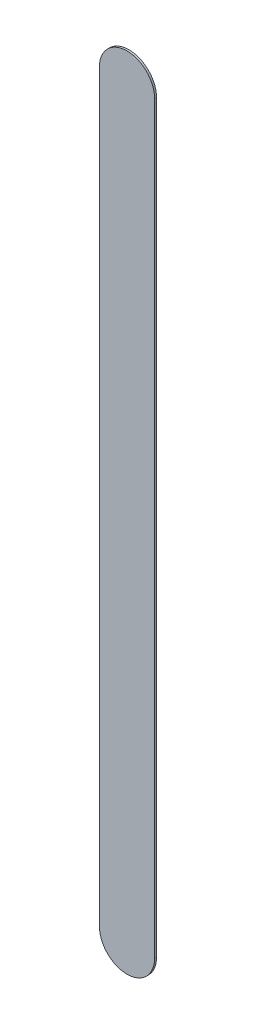
ISO-10303-21;
HEADER;
FILE_DESCRIPTION(('STEP AP214'),'2;1');
FILE_NAME('part.step','',(''),(''),'','','');
FILE_SCHEMA(('AUTOMOTIVE_DESIGN { 1 0 10303 214 1 1 1 1 }'));
ENDSEC;
DATA;
#1=APPLICATION_CONTEXT('core data for automotive mechanical design processes');
#2=APPLICATION_PROTOCOL_DEFINITION('international standard','automotive_design',2000,#1);
#3=PRODUCT_CONTEXT('',#1,'mechanical');
#4=PRODUCT('Part','Part','',(#3));
#5=PRODUCT_RELATED_PRODUCT_CATEGORY('part','',(#4));
#6=PRODUCT_DEFINITION_FORMATION('','',#4);
#7=PRODUCT_DEFINITION_CONTEXT('part definition',#1,'design');
#8=PRODUCT_DEFINITION('design','',#6,#7);
#9=PRODUCT_DEFINITION_SHAPE('','',#8);
#10=(LENGTH_UNIT() NAMED_UNIT(*) SI_UNIT(.MILLI.,.METRE.));
#11=(NAMED_UNIT(*) PLANE_ANGLE_UNIT() SI_UNIT($,.RADIAN.));
#12=(NAMED_UNIT(*) SI_UNIT($,.STERADIAN.) SOLID_ANGLE_UNIT());
#13=UNCERTAINTY_MEASURE_WITH_UNIT(LENGTH_MEASURE(1.E-05),#10,'distance_accuracy_value','');
#14=(GEOMETRIC_REPRESENTATION_CONTEXT(3) GLOBAL_UNCERTAINTY_ASSIGNED_CONTEXT((#13)) GLOBAL_UNIT_ASSIGNED_CONTEXT((#10,
#11,#12)) REPRESENTATION_CONTEXT('',''));
#15=CARTESIAN_POINT('',(0.,0.,0.));
#16=DIRECTION('',(0.,0.,1.));
#17=DIRECTION('',(1.,0.,0.));
#18=AXIS2_PLACEMENT_3D('',#15,#16,#17);
#19=CARTESIAN_POINT('',(99.89999832,99.50000166,0.));
#20=DIRECTION('',(-1.,0.,0.));
#21=DIRECTION('',(0.,1.,0.));
#22=AXIS2_PLACEMENT_3D('',#19,#20,#21);
#23=PLANE('',#22);
#24=DIRECTION('',(0.,1.,0.));
#25=VECTOR('',#24,1.);
#26=CARTESIAN_POINT('',(99.89999832,99.50000166,0.03556));
#27=LINE('',#26,#25);
#28=CARTESIAN_POINT('',(99.89999832,99.50000166,0.03556));
#29=VERTEX_POINT('',#28);
#30=CARTESIAN_POINT('',(99.89999832,113.00000006,0.03556));
#31=VERTEX_POINT('',#30);
#32=EDGE_CURVE('E11',#29,#31,#27,.T.);
#33=ORIENTED_EDGE('',*,*,#32,.F.);
#34=DIRECTION('',(0.,0.,1.));
#35=VECTOR('',#34,1.);
#36=CARTESIAN_POINT('',(99.89999832,99.50000166,0.));
#37=LINE('',#36,#35);
#38=CARTESIAN_POINT('',(99.89999832,99.50000166,0.));
#39=VERTEX_POINT('',#38);
#40=EDGE_CURVE('E24',#39,#29,#37,.T.);
#41=ORIENTED_EDGE('',*,*,#40,.F.);
#42=DIRECTION('',(0.,1.,0.));
#43=VECTOR('',#42,1.);
#44=CARTESIAN_POINT('',(99.89999832,99.50000166,0.));
#45=LINE('',#44,#43);
#46=CARTESIAN_POINT('',(99.89999832,113.00000006,0.));
#47=VERTEX_POINT('',#46);
#48=EDGE_CURVE('E75',#39,#47,#45,.T.);
#49=ORIENTED_EDGE('',*,*,#48,.T.);
#50=DIRECTION('',(0.,0.,1.));
#51=VECTOR('',#50,1.);
#52=CARTESIAN_POINT('',(99.89999832,113.00000006,0.));
#53=LINE('',#52,#51);
#54=EDGE_CURVE('E37',#47,#31,#53,.T.);
#55=ORIENTED_EDGE('',*,*,#54,.T.);
#56=EDGE_LOOP('',(#33,#41,#49,#55));
#57=FACE_BOUND('',#56,.T.);
#58=ADVANCED_FACE('F17',(#57),#23,.F.);
#59=CARTESIAN_POINT('',(99.39999932,113.00000006,0.));
#60=DIRECTION('',(0.,0.,-1.));
#61=DIRECTION('',(1.,0.,0.));
#62=AXIS2_PLACEMENT_3D('',#59,#60,#61);
#63=CYLINDRICAL_SURFACE('',#62,0.499999000000012);
#64=CARTESIAN_POINT('',(99.39999932,113.00000006,0.03556));
#65=DIRECTION('',(0.,0.,1.));
#66=DIRECTION('',(1.,0.,0.));
#67=AXIS2_PLACEMENT_3D('',#64,#65,#66);
#68=CIRCLE('',#67,0.499999000000012);
#69=CARTESIAN_POINT('',(98.90000032,113.00000006,0.03556));
#70=VERTEX_POINT('',#69);
#71=EDGE_CURVE('E83',#31,#70,#68,.T.);
#72=ORIENTED_EDGE('',*,*,#71,.F.);
#73=ORIENTED_EDGE('',*,*,#54,.F.);
#74=CARTESIAN_POINT('',(99.39999932,113.00000006,0.));
#75=DIRECTION('',(0.,0.,1.));
#76=DIRECTION('',(1.,0.,0.));
#77=AXIS2_PLACEMENT_3D('',#74,#75,#76);
#78=CIRCLE('',#77,0.499999000000012);
#79=CARTESIAN_POINT('',(98.90000032,113.00000006,0.));
#80=VERTEX_POINT('',#79);
#81=EDGE_CURVE('E81',#47,#80,#78,.T.);
#82=ORIENTED_EDGE('',*,*,#81,.T.);
#83=DIRECTION('',(0.,0.,1.));
#84=VECTOR('',#83,1.);
#85=CARTESIAN_POINT('',(98.90000032,113.00000006,0.));
#86=LINE('',#85,#84);
#87=EDGE_CURVE('E67',#80,#70,#86,.T.);
#88=ORIENTED_EDGE('',*,*,#87,.T.);
#89=EDGE_LOOP('',(#72,#73,#82,#88));
#90=FACE_BOUND('',#89,.T.);
#91=ADVANCED_FACE('F89',(#90),#63,.T.);
#92=CARTESIAN_POINT('',(98.90000032,113.00000006,0.));
#93=DIRECTION('',(1.,0.,0.));
#94=DIRECTION('',(0.,-1.,0.));
#95=AXIS2_PLACEMENT_3D('',#92,#93,#94);
#96=PLANE('',#95);
#97=DIRECTION('',(0.,-1.,0.));
#98=VECTOR('',#97,1.);
#99=CARTESIAN_POINT('',(98.90000032,113.00000006,0.03556));
#100=LINE('',#99,#98);
#101=CARTESIAN_POINT('',(98.90000032,99.50000166,0.03556));
#102=VERTEX_POINT('',#101);
#103=EDGE_CURVE('E71',#70,#102,#100,.T.);
#104=ORIENTED_EDGE('',*,*,#103,.F.);
#105=ORIENTED_EDGE('',*,*,#87,.F.);
#106=DIRECTION('',(0.,-1.,0.));
#107=VECTOR('',#106,1.);
#108=CARTESIAN_POINT('',(98.90000032,113.00000006,0.));
#109=LINE('',#108,#107);
#110=CARTESIAN_POINT('',(98.90000032,99.50000166,0.));
#111=VERTEX_POINT('',#110);
#112=EDGE_CURVE('E63',#80,#111,#109,.T.);
#113=ORIENTED_EDGE('',*,*,#112,.T.);
#114=DIRECTION('',(0.,0.,1.));
#115=VECTOR('',#114,1.);
#116=CARTESIAN_POINT('',(98.90000032,99.50000166,0.));
#117=LINE('',#116,#115);
#118=EDGE_CURVE('E53',#111,#102,#117,.T.);
#119=ORIENTED_EDGE('',*,*,#118,.T.);
#120=EDGE_LOOP('',(#104,#105,#113,#119));
#121=FACE_BOUND('',#120,.T.);
#122=ADVANCED_FACE('F66',(#121),#96,.F.);
#123=CARTESIAN_POINT('',(99.39999932,99.50000166,0.));
#124=DIRECTION('',(0.,0.,-1.));
#125=DIRECTION('',(-1.,0.,0.));
#126=AXIS2_PLACEMENT_3D('',#123,#124,#125);
#127=CYLINDRICAL_SURFACE('',#126,0.499999000000012);
#128=CARTESIAN_POINT('',(99.39999932,99.50000166,0.03556));
#129=DIRECTION('',(0.,0.,1.));
#130=DIRECTION('',(-1.,0.,0.));
#131=AXIS2_PLACEMENT_3D('',#128,#129,#130);
#132=CIRCLE('',#131,0.499999000000012);
#133=EDGE_CURVE('E59',#102,#29,#132,.T.);
#134=ORIENTED_EDGE('',*,*,#133,.F.);
#135=ORIENTED_EDGE('',*,*,#118,.F.);
#136=CARTESIAN_POINT('',(99.39999932,99.50000166,0.));
#137=DIRECTION('',(0.,0.,1.));
#138=DIRECTION('',(-1.,0.,0.));
#139=AXIS2_PLACEMENT_3D('',#136,#137,#138);
#140=CIRCLE('',#139,0.499999000000012);
#141=EDGE_CURVE('E57',#111,#39,#140,.T.);
#142=ORIENTED_EDGE('',*,*,#141,.T.);
#143=ORIENTED_EDGE('',*,*,#40,.T.);
#144=EDGE_LOOP('',(#134,#135,#142,#143));
#145=FACE_BOUND('',#144,.T.);
#146=ADVANCED_FACE('F55',(#145),#127,.T.);
#147=CARTESIAN_POINT('',(99.89999832,99.50000166,0.));
#148=DIRECTION('',(0.,0.,-1.));
#149=DIRECTION('',(-1.,0.,0.));
#150=AXIS2_PLACEMENT_3D('',#147,#148,#149);
#151=PLANE('',#150);
#152=ORIENTED_EDGE('',*,*,#141,.F.);
#153=ORIENTED_EDGE('',*,*,#112,.F.);
#154=ORIENTED_EDGE('',*,*,#81,.F.);
#155=ORIENTED_EDGE('',*,*,#48,.F.);
#156=EDGE_LOOP('',(#152,#153,#154,#155));
#157=FACE_BOUND('',#156,.T.);
#158=ADVANCED_FACE('F74',(#157),#151,.T.);
#159=CARTESIAN_POINT('',(99.89999832,99.50000166,0.03556));
#160=DIRECTION('',(0.,0.,-1.));
#161=DIRECTION('',(-1.,0.,0.));
#162=AXIS2_PLACEMENT_3D('',#159,#160,#161);
#163=PLANE('',#162);
#164=ORIENTED_EDGE('',*,*,#32,.T.);
#165=ORIENTED_EDGE('',*,*,#71,.T.);
#166=ORIENTED_EDGE('',*,*,#103,.T.);
#167=ORIENTED_EDGE('',*,*,#133,.T.);
#168=EDGE_LOOP('',(#164,#165,#166,#167));
#169=FACE_BOUND('',#168,.T.);
#170=ADVANCED_FACE('F91',(#169),#163,.F.);
#171=CLOSED_SHELL('',(#58,#91,#122,#146,#158,#170));
#172=MANIFOLD_SOLID_BREP('B1',#171);
#173=ADVANCED_BREP_SHAPE_REPRESENTATION('',(#18,#172),#14);
#174=SHAPE_DEFINITION_REPRESENTATION(#9,#173);
ENDSEC;
END-ISO-10303-21;
